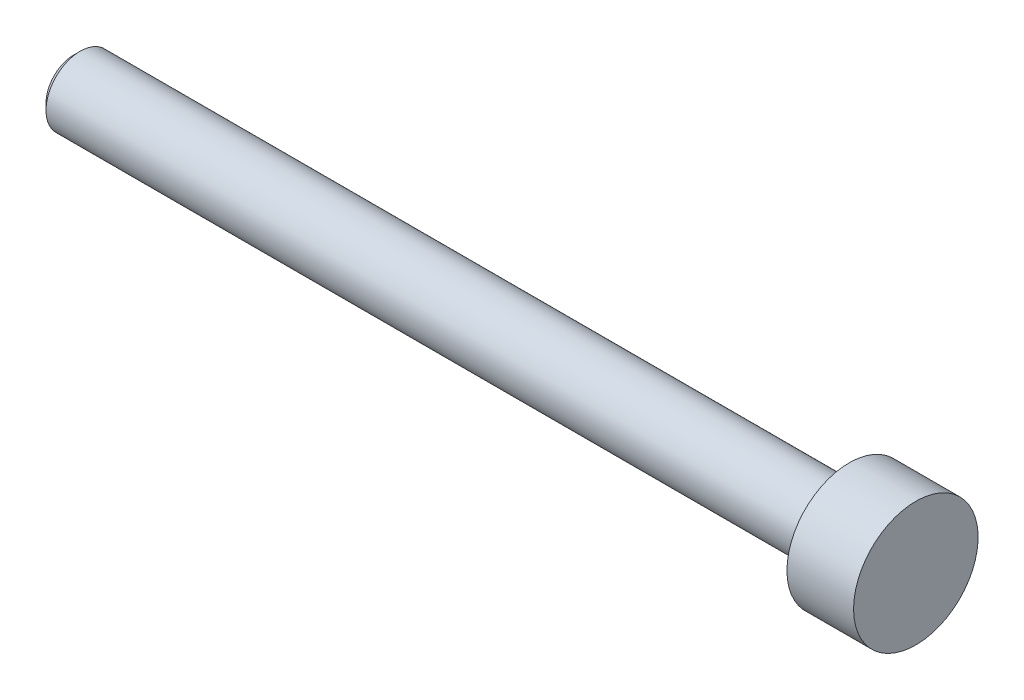
ISO-10303-21;
HEADER;
FILE_DESCRIPTION(('STEP AP214'),'2;1');
FILE_NAME('part.step','',(''),(''),'','','');
FILE_SCHEMA(('AUTOMOTIVE_DESIGN { 1 0 10303 214 1 1 1 1 }'));
ENDSEC;
DATA;
#1=APPLICATION_CONTEXT('core data for automotive mechanical design processes');
#2=APPLICATION_PROTOCOL_DEFINITION('international standard','automotive_design',2000,#1);
#3=PRODUCT_CONTEXT('',#1,'mechanical');
#4=PRODUCT('Part','Part','',(#3));
#5=PRODUCT_RELATED_PRODUCT_CATEGORY('part','',(#4));
#6=PRODUCT_DEFINITION_FORMATION('','',#4);
#7=PRODUCT_DEFINITION_CONTEXT('part definition',#1,'design');
#8=PRODUCT_DEFINITION('design','',#6,#7);
#9=PRODUCT_DEFINITION_SHAPE('','',#8);
#10=(LENGTH_UNIT() NAMED_UNIT(*) SI_UNIT(.MILLI.,.METRE.));
#11=(NAMED_UNIT(*) PLANE_ANGLE_UNIT() SI_UNIT($,.RADIAN.));
#12=(NAMED_UNIT(*) SI_UNIT($,.STERADIAN.) SOLID_ANGLE_UNIT());
#13=UNCERTAINTY_MEASURE_WITH_UNIT(LENGTH_MEASURE(1.E-05),#10,'distance_accuracy_value','');
#14=(GEOMETRIC_REPRESENTATION_CONTEXT(3) GLOBAL_UNCERTAINTY_ASSIGNED_CONTEXT((#13)) GLOBAL_UNIT_ASSIGNED_CONTEXT((#10,
#11,#12)) REPRESENTATION_CONTEXT('',''));
#15=CARTESIAN_POINT('',(0.,0.,0.));
#16=DIRECTION('',(0.,0.,1.));
#17=DIRECTION('',(1.,0.,0.));
#18=AXIS2_PLACEMENT_3D('',#15,#16,#17);
#19=CARTESIAN_POINT('',(34.000000072,0.,0.));
#20=DIRECTION('',(1.,0.,0.));
#21=DIRECTION('',(0.,0.,-1.));
#22=AXIS2_PLACEMENT_3D('',#19,#20,#21);
#23=PLANE('',#22);
#24=CARTESIAN_POINT('',(34.000000072,0.,0.));
#25=DIRECTION('',(-1.,0.,0.));
#26=DIRECTION('',(0.,0.,1.));
#27=AXIS2_PLACEMENT_3D('',#24,#25,#26);
#28=CIRCLE('',#27,2.73050000000001);
#29=CARTESIAN_POINT('',(34.000000072,0.,2.7305));
#30=VERTEX_POINT('',#29);
#31=EDGE_CURVE('E10',#30,#30,#28,.T.);
#32=ORIENTED_EDGE('',*,*,#31,.T.);
#33=EDGE_LOOP('',(#32));
#34=FACE_BOUND('',#33,.T.);
#35=CARTESIAN_POINT('',(34.000000072,0.,0.));
#36=DIRECTION('',(1.,0.,0.));
#37=DIRECTION('',(0.,0.,-1.));
#38=AXIS2_PLACEMENT_3D('',#35,#36,#37);
#39=CIRCLE('',#38,1.5);
#40=CARTESIAN_POINT('',(34.000000072,0.,-1.5));
#41=VERTEX_POINT('',#40);
#42=EDGE_CURVE('E62',#41,#41,#39,.T.);
#43=ORIENTED_EDGE('',*,*,#42,.T.);
#44=EDGE_LOOP('',(#43));
#45=FACE_BOUND('',#44,.T.);
#46=ADVANCED_FACE('F49',(#34,#45),#23,.F.);
#47=CARTESIAN_POINT('',(0.,0.,0.));
#48=DIRECTION('',(-1.,0.,0.));
#49=DIRECTION('',(0.,0.,1.));
#50=AXIS2_PLACEMENT_3D('',#47,#48,#49);
#51=CYLINDRICAL_SURFACE('',#50,2.73050000000001);
#52=ORIENTED_EDGE('',*,*,#31,.F.);
#53=EDGE_LOOP('',(#52));
#54=FACE_BOUND('',#53,.T.);
#55=CARTESIAN_POINT('',(36.921000072,0.,0.));
#56=DIRECTION('',(-1.,0.,0.));
#57=DIRECTION('',(0.,0.,1.));
#58=AXIS2_PLACEMENT_3D('',#55,#56,#57);
#59=CIRCLE('',#58,2.73050000000001);
#60=CARTESIAN_POINT('',(36.921000072,0.,2.7305));
#61=VERTEX_POINT('',#60);
#62=EDGE_CURVE('E57',#61,#61,#59,.T.);
#63=ORIENTED_EDGE('',*,*,#62,.T.);
#64=EDGE_LOOP('',(#63));
#65=FACE_BOUND('',#64,.T.);
#66=ADVANCED_FACE('F91',(#54,#65),#51,.T.);
#67=CARTESIAN_POINT('',(36.921000072,0.,0.));
#68=DIRECTION('',(-1.,0.,0.));
#69=DIRECTION('',(0.,0.,1.));
#70=AXIS2_PLACEMENT_3D('',#67,#68,#69);
#71=PLANE('',#70);
#72=ORIENTED_EDGE('',*,*,#62,.F.);
#73=EDGE_LOOP('',(#72));
#74=FACE_BOUND('',#73,.T.);
#75=ADVANCED_FACE('F97',(#74),#71,.F.);
#76=CARTESIAN_POINT('',(0.,0.,0.));
#77=DIRECTION('',(1.,0.,0.));
#78=DIRECTION('',(0.,0.,-1.));
#79=AXIS2_PLACEMENT_3D('',#76,#77,#78);
#80=CYLINDRICAL_SURFACE('',#79,1.5);
#81=ORIENTED_EDGE('',*,*,#42,.F.);
#82=EDGE_LOOP('',(#81));
#83=FACE_BOUND('',#82,.T.);
#84=CARTESIAN_POINT('',(0.280499999999996,0.,0.));
#85=DIRECTION('',(1.,0.,0.));
#86=DIRECTION('',(0.,0.,-1.));
#87=AXIS2_PLACEMENT_3D('',#84,#85,#86);
#88=CIRCLE('',#87,1.5);
#89=CARTESIAN_POINT('',(0.280499999999996,0.,-1.5));
#90=VERTEX_POINT('',#89);
#91=EDGE_CURVE('E73',#90,#90,#88,.T.);
#92=ORIENTED_EDGE('',*,*,#91,.T.);
#93=EDGE_LOOP('',(#92));
#94=FACE_BOUND('',#93,.T.);
#95=ADVANCED_FACE('F78',(#83,#94),#80,.T.);
#96=CARTESIAN_POINT('',(0.,0.,0.));
#97=DIRECTION('',(1.,0.,0.));
#98=DIRECTION('',(0.,0.,-1.));
#99=AXIS2_PLACEMENT_3D('',#96,#97,#98);
#100=CONICAL_SURFACE('',#99,1.2195,0.785398163397447);
#101=ORIENTED_EDGE('',*,*,#91,.F.);
#102=EDGE_LOOP('',(#101));
#103=FACE_BOUND('',#102,.T.);
#104=CARTESIAN_POINT('',(0.,0.,0.));
#105=DIRECTION('',(1.,0.,0.));
#106=DIRECTION('',(0.,0.,-1.));
#107=AXIS2_PLACEMENT_3D('',#104,#105,#106);
#108=CIRCLE('',#107,1.2195);
#109=CARTESIAN_POINT('',(0.,0.,-1.2195));
#110=VERTEX_POINT('',#109);
#111=EDGE_CURVE('E67',#110,#110,#108,.T.);
#112=ORIENTED_EDGE('',*,*,#111,.T.);
#113=EDGE_LOOP('',(#112));
#114=FACE_BOUND('',#113,.T.);
#115=ADVANCED_FACE('F80',(#103,#114),#100,.T.);
#116=CARTESIAN_POINT('',(0.,0.,0.));
#117=DIRECTION('',(1.,0.,0.));
#118=DIRECTION('',(0.,0.,-1.));
#119=AXIS2_PLACEMENT_3D('',#116,#117,#118);
#120=PLANE('',#119);
#121=ORIENTED_EDGE('',*,*,#111,.F.);
#122=EDGE_LOOP('',(#121));
#123=FACE_BOUND('',#122,.T.);
#124=ADVANCED_FACE('F51',(#123),#120,.F.);
#125=CLOSED_SHELL('',(#46,#66,#75,#95,#115,#124));
#126=MANIFOLD_SOLID_BREP('B2',#125);
#127=ADVANCED_BREP_SHAPE_REPRESENTATION('',(#18,#126),#14);
#128=SHAPE_DEFINITION_REPRESENTATION(#9,#127);
ENDSEC;
END-ISO-10303-21;
